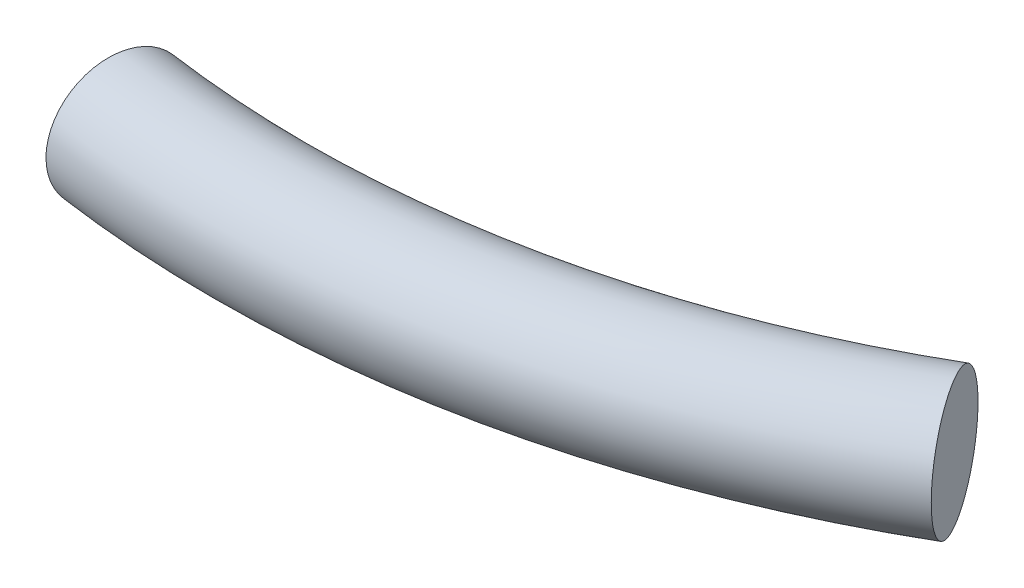
ISO-10303-21;
HEADER;
FILE_DESCRIPTION(('STEP AP214'),'2;1');
FILE_NAME('part.step','',(''),(''),'','','');
FILE_SCHEMA(('AUTOMOTIVE_DESIGN { 1 0 10303 214 1 1 1 1 }'));
ENDSEC;
DATA;
#1=APPLICATION_CONTEXT('core data for automotive mechanical design processes');
#2=APPLICATION_PROTOCOL_DEFINITION('international standard','automotive_design',2000,#1);
#3=PRODUCT_CONTEXT('',#1,'mechanical');
#4=PRODUCT('Part','Part','',(#3));
#5=PRODUCT_RELATED_PRODUCT_CATEGORY('part','',(#4));
#6=PRODUCT_DEFINITION_FORMATION('','',#4);
#7=PRODUCT_DEFINITION_CONTEXT('part definition',#1,'design');
#8=PRODUCT_DEFINITION('design','',#6,#7);
#9=PRODUCT_DEFINITION_SHAPE('','',#8);
#10=(LENGTH_UNIT() NAMED_UNIT(*) SI_UNIT(.MILLI.,.METRE.));
#11=(NAMED_UNIT(*) PLANE_ANGLE_UNIT() SI_UNIT($,.RADIAN.));
#12=(NAMED_UNIT(*) SI_UNIT($,.STERADIAN.) SOLID_ANGLE_UNIT());
#13=UNCERTAINTY_MEASURE_WITH_UNIT(LENGTH_MEASURE(1.E-05),#10,'distance_accuracy_value','');
#14=(GEOMETRIC_REPRESENTATION_CONTEXT(3) GLOBAL_UNCERTAINTY_ASSIGNED_CONTEXT((#13)) GLOBAL_UNIT_ASSIGNED_CONTEXT((#10,
#11,#12)) REPRESENTATION_CONTEXT('',''));
#15=CARTESIAN_POINT('',(0.,0.,0.));
#16=DIRECTION('',(0.,0.,1.));
#17=DIRECTION('',(1.,0.,0.));
#18=AXIS2_PLACEMENT_3D('',#15,#16,#17);
#19=CARTESIAN_POINT('',(0.,0.,0.));
#20=DIRECTION('',(0.990268068741566,0.,0.139173100960095));
#21=DIRECTION('',(0.139173100960095,0.,-0.990268068741566));
#22=AXIS2_PLACEMENT_3D('',#19,#20,#21);
#23=PLANE('',#22);
#24=CARTESIAN_POINT('',(-1.01069952865196,5.2698,7.19150082459654));
#25=CARTESIAN_POINT('',(-1.01069927178318,5.24734475844036,7.19149899688026));
#26=CARTESIAN_POINT('',(-1.01043539930995,5.22486914274062,7.18962144667368));
#27=CARTESIAN_POINT('',(-1.00938562896349,5.1805175487025,7.18215194253495));
#28=CARTESIAN_POINT('',(-1.00859861383822,5.158642958289,7.17655203894157));
#29=CARTESIAN_POINT('',(-1.00652600498841,5.11619038165277,7.16180466068529));
#30=CARTESIAN_POINT('',(-1.00524130113906,5.09561015699665,7.15266351781338));
#31=CARTESIAN_POINT('',(-1.00220740027461,5.05626266277757,7.13107619146179));
#32=CARTESIAN_POINT('',(-1.00045754432399,5.03749801701042,7.11862531941221));
#33=CARTESIAN_POINT('',(-0.996546737400909,5.00237251506183,7.09079848224164));
#34=CARTESIAN_POINT('',(-0.994386369577103,4.98600830669737,7.07542666643893));
#35=CARTESIAN_POINT('',(-0.989710874817703,4.9560951150933,7.04215879259073));
#36=CARTESIAN_POINT('',(-0.98719525548802,4.94255010496093,7.02425923097925));
#37=CARTESIAN_POINT('',(-0.981885019282246,4.91869805812555,6.98647493706198));
#38=CARTESIAN_POINT('',(-0.979090606951195,4.90838867019989,6.96659166016979));
#39=CARTESIAN_POINT('',(-0.973300394573009,4.89128651697562,6.92539215832789));
#40=CARTESIAN_POINT('',(-0.970304582689795,4.88449395856254,6.90407584916011));
#41=CARTESIAN_POINT('',(-0.964196859795768,4.87461938707083,6.86061714260724));
#42=CARTESIAN_POINT('',(-0.961084952201854,4.87153726487626,6.83847476953465));
#43=CARTESIAN_POINT('',(-0.954833291639521,4.8691706838228,6.79399189325481));
#44=CARTESIAN_POINT('',(-0.951693538671101,4.86988622496392,6.77165139004755));
#45=CARTESIAN_POINT('',(-0.945475222947479,4.87509474506563,6.72740577462348));
#46=CARTESIAN_POINT('',(-0.942396661994562,4.87958783511791,6.70550067523059));
#47=CARTESIAN_POINT('',(-0.936388403739214,4.89222364907398,6.66274969635622));
#48=CARTESIAN_POINT('',(-0.933458697691698,4.90036615830119,6.64190375465024));
#49=CARTESIAN_POINT('',(-0.927829048823482,4.92007688548478,6.60184672154569));
#50=CARTESIAN_POINT('',(-0.925129275031465,4.93164759608104,6.5826368328487));
#51=CARTESIAN_POINT('',(-0.920042216243384,4.95786514969766,6.54644052877201));
#52=CARTESIAN_POINT('',(-0.917654499681348,4.97250766984349,6.52945104264086));
#53=CARTESIAN_POINT('',(-0.913251671250836,5.00448602525169,6.49812329053354));
#54=CARTESIAN_POINT('',(-0.91123709028082,5.02182563442235,6.48378880209621));
#55=CARTESIAN_POINT('',(-0.907644571500182,5.05866468164223,6.45822670273738));
#56=CARTESIAN_POINT('',(-0.906066016771936,5.07816101291839,6.44699470221888));
#57=CARTESIAN_POINT('',(-0.903384060007921,5.11881373737466,6.42791158826347));
#58=CARTESIAN_POINT('',(-0.90228151018648,5.1399730284603,6.42006653864657));
#59=CARTESIAN_POINT('',(-0.900588958570666,5.18328650996402,6.40802340812585));
#60=CARTESIAN_POINT('',(-0.899997866006126,5.20543847660513,6.40381756598899));
#61=CARTESIAN_POINT('',(-0.899463765195616,5.241730237853,6.40001724125318));
#62=CARTESIAN_POINT('',(-0.899360887291289,5.25576113714254,6.39928522692762));
#63=CARTESIAN_POINT('',(-0.899361304752654,5.29225524155964,6.39928819731958));
#64=CARTESIAN_POINT('',(-0.899625177225881,5.31473085725938,6.40116574752616));
#65=CARTESIAN_POINT('',(-0.90067494757235,5.3590824512975,6.40863525166488));
#66=CARTESIAN_POINT('',(-0.90146196269762,5.380957041711,6.41423515525827));
#67=CARTESIAN_POINT('',(-0.90353457154743,5.42340961834723,6.42898253351455));
#68=CARTESIAN_POINT('',(-0.904819275396779,5.44398984300335,6.43812367638645));
#69=CARTESIAN_POINT('',(-0.907853176261226,5.48333733722242,6.45971100273805));
#70=CARTESIAN_POINT('',(-0.909603032211847,5.50210198298958,6.47216187478762));
#71=CARTESIAN_POINT('',(-0.913513839134928,5.53722748493817,6.49998871195819));
#72=CARTESIAN_POINT('',(-0.915674206958731,5.55359169330263,6.51536052776091));
#73=CARTESIAN_POINT('',(-0.920349701718132,5.5835048849067,6.5486284016091));
#74=CARTESIAN_POINT('',(-0.92286532104782,5.59704989503907,6.56652796322059));
#75=CARTESIAN_POINT('',(-0.928175557253594,5.62090194187445,6.60431225713785));
#76=CARTESIAN_POINT('',(-0.930969969584641,5.6312113298001,6.62419553403005));
#77=CARTESIAN_POINT('',(-0.936760181962824,5.64831348302438,6.66539503587195));
#78=CARTESIAN_POINT('',(-0.939755993846039,5.65510604143746,6.68671134503973));
#79=CARTESIAN_POINT('',(-0.945863716740068,5.66498061292917,6.7301700515926));
#80=CARTESIAN_POINT('',(-0.948975624333981,5.66806273512374,6.75231242466518));
#81=CARTESIAN_POINT('',(-0.955227284896314,5.6704293161772,6.79679530094502));
#82=CARTESIAN_POINT('',(-0.958367037864734,5.66971377503608,6.81913580415228));
#83=CARTESIAN_POINT('',(-0.964585353588356,5.66450525493437,6.86338141957636));
#84=CARTESIAN_POINT('',(-0.967663914541272,5.66001216488209,6.88528651896925));
#85=CARTESIAN_POINT('',(-0.973672172796621,5.64737635092602,6.92803749784361));
#86=CARTESIAN_POINT('',(-0.976601878844139,5.63923384169881,6.94888343954959));
#87=CARTESIAN_POINT('',(-0.982231527712355,5.61952311451522,6.98894047265414));
#88=CARTESIAN_POINT('',(-0.984931301504369,5.60795240391896,7.00815036135113));
#89=CARTESIAN_POINT('',(-0.990018360292451,5.58173485030234,7.04434666542783));
#90=CARTESIAN_POINT('',(-0.992406076854489,5.56709233015651,7.06133615155898));
#91=CARTESIAN_POINT('',(-0.996808905285002,5.53511397474831,7.09266390366629));
#92=CARTESIAN_POINT('',(-0.998823486255016,5.51777436557765,7.10699839210362));
#93=CARTESIAN_POINT('',(-1.00241600503565,5.48093531835777,7.13256049146246));
#94=CARTESIAN_POINT('',(-1.0039945597639,5.46143898708161,7.14379249198096));
#95=CARTESIAN_POINT('',(-1.00667651652791,5.42078626262534,7.16287560593637));
#96=CARTESIAN_POINT('',(-1.00777906634936,5.3996269715397,7.17072065555326));
#97=CARTESIAN_POINT('',(-1.00947161796517,5.35631349003598,7.18276378607399));
#98=CARTESIAN_POINT('',(-1.01006271052971,5.33416152339487,7.18696962821084));
#99=CARTESIAN_POINT('',(-1.01059681134022,5.29786976214701,7.19076995294666));
#100=CARTESIAN_POINT('',(-1.01069968924455,5.28383886285746,7.19150196727222));
#101=CARTESIAN_POINT('',(-1.01069952865196,5.2698,7.19150082459654));
#102=B_SPLINE_CURVE_WITH_KNOTS('',3,(#24,#25,#26,#27,#28,#29,#30,#31,#32,#33,#34,#35,#36,#37,
#38,#39,#40,#41,#42,#43,#44,#45,#46,#47,#48,#49,#50,#51,#52,#53,#54,#55,#56,#57,#58,#59,#60,#61,
#62,#63,#64,#65,#66,#67,#68,#69,#70,#71,#72,#73,#74,#75,#76,#77,#78,#79,#80,#81,#82,#83,#84,#85,
#86,#87,#88,#89,#90,#91,#92,#93,#94,#95,#96,#97,#98,#99,#100,#101),.UNSPECIFIED.,.T.,.F.,(4,2,2,
2,2,2,2,2,2,2,2,2,2,2,2,2,2,2,2,2,2,2,2,2,2,2,2,2,2,2,2,2,2,2,2,2,2,2,4),(0.,0.067321719094076,
0.134787678055462,0.202133559490901,0.269575356418627,0.336922056232695,0.404363034793471,
0.471754892083668,0.539150713403567,0.606544552708822,0.673938392014078,0.741334213333977,
0.808726070624174,0.876167049184949,0.943513748999019,1.01095554592846,1.07830142736561,
1.14576738632871,1.2130891054245,1.25517818200736,1.32249990110144,1.38996586006282,
1.45731174149826,1.52475353842599,1.59210023824006,1.65954121680083,1.72693307409103,
1.79432889541093,1.86172273471618,1.92911657402144,1.99651239534134,2.06390425263154,
2.13134523119231,2.19869193100638,2.26613372793582,2.33347960937297,2.40094556833607,
2.46826728743186,2.51035636401472),.UNSPECIFIED.);
#103=CARTESIAN_POINT('',(-1.01069952865196,5.2698,7.19150082459654));
#104=VERTEX_POINT('',#103);
#105=EDGE_CURVE('E18',#104,#104,#102,.T.);
#106=ORIENTED_EDGE('',*,*,#105,.F.);
#107=EDGE_LOOP('',(#106));
#108=FACE_BOUND('',#107,.T.);
#109=ADVANCED_FACE('F14',(#108),#23,.F.);
#110=CARTESIAN_POINT('',(0.,0.,0.));
#111=DIRECTION('',(0.866025403784429,0.,-0.500000000000017));
#112=DIRECTION('',(-0.500000000000017,0.,-0.866025403784429));
#113=AXIS2_PLACEMENT_3D('',#110,#111,#112);
#114=PLANE('',#113);
#115=CARTESIAN_POINT('',(3.23108791023411,5.2698,5.59640842424678));
#116=CARTESIAN_POINT('',(3.23108883307326,5.24734475844036,5.59641002265107));
#117=CARTESIAN_POINT('',(3.23203683405696,5.22486914274062,5.59805200852046));
#118=CARTESIAN_POINT('',(3.23580828967312,5.18051754870249,5.60458436126614));
#119=CARTESIAN_POINT('',(3.23863575819914,5.158642958289,5.60948168041002));
#120=CARTESIAN_POINT('',(3.24608191279192,5.11619038165277,5.62237879848572));
#121=CARTESIAN_POINT('',(3.25069740185011,5.09561015699665,5.63037306003628));
#122=CARTESIAN_POINT('',(3.26159714053351,5.05626266277757,5.64925196122515));
#123=CARTESIAN_POINT('',(3.26788375748229,5.03749801701042,5.66014070118817));
#124=CARTESIAN_POINT('',(3.2819339111977,5.00237251506183,5.68447628127742));
#125=CARTESIAN_POINT('',(3.28969535291633,4.98600830669737,5.69791949267407));
#126=CARTESIAN_POINT('',(3.30649276106182,4.9560951150933,5.72701345701752));
#127=CARTESIAN_POINT('',(3.31553049648746,4.94255010496093,5.74266727396009));
#128=CARTESIAN_POINT('',(3.33460830739036,4.91869805812555,5.77571101174111));
#129=CARTESIAN_POINT('',(3.34464764800924,4.90838867019989,5.7930996597675));
#130=CARTESIAN_POINT('',(3.36544984447624,4.89128651697562,5.82913012095736));
#131=CARTESIAN_POINT('',(3.37621274284721,4.88449395856254,5.84777200777259));
#132=CARTESIAN_POINT('',(3.39815564291875,4.87461938707083,5.88577822556191));
#133=CARTESIAN_POINT('',(3.4093356323436,4.87153726487626,5.90514253527382));
#134=CARTESIAN_POINT('',(3.43179564982976,4.8691706838228,5.94404442669873));
#135=CARTESIAN_POINT('',(3.44307567789108,4.86988622496392,5.96358200841173));
#136=CARTESIAN_POINT('',(3.46541589910022,4.87509474506563,6.0022764065983));
#137=CARTESIAN_POINT('',(3.47647608577307,4.87958783511791,6.02143321185687));
#138=CARTESIAN_POINT('',(3.49806164438282,4.89222364907398,6.05882049607871));
#139=CARTESIAN_POINT('',(3.50858704773773,4.90036615830119,6.07705102945957));
#140=CARTESIAN_POINT('',(3.52881239598886,4.92007688548478,6.1120823602313));
#141=CARTESIAN_POINT('',(3.53851173362448,4.93164759608104,6.12888210581595));
#142=CARTESIAN_POINT('',(3.55678774656444,4.95786514969766,6.16053708878774));
#143=CARTESIAN_POINT('',(3.56536597233351,4.97250766984349,6.17539501165859));
#144=CARTESIAN_POINT('',(3.58118378626501,5.00448602525169,6.20279226905261));
#145=CARTESIAN_POINT('',(3.588421467096,5.02182563442235,6.21532829998084));
#146=CARTESIAN_POINT('',(3.601328123468,5.05866468164223,6.23768328457299));
#147=CARTESIAN_POINT('',(3.60699931537706,5.07816101291839,6.24750607709896));
#148=CARTESIAN_POINT('',(3.61663464269791,5.11881373737466,6.26419495356622));
#149=CARTESIAN_POINT('',(3.62059571640337,5.1399730284603,6.27105573447659));
#150=CARTESIAN_POINT('',(3.626676459033,5.18328650996402,6.28158788965887));
#151=CARTESIAN_POINT('',(3.62880004671073,5.20543847660513,6.28526605141102));
#152=CARTESIAN_POINT('',(3.63071888306211,5.241730237853,6.28858957346302));
#153=CARTESIAN_POINT('',(3.63108848718682,5.25576113714254,6.28922974658571));
#154=CARTESIAN_POINT('',(3.63108698739497,5.29225524155964,6.28922714887002));
#155=CARTESIAN_POINT('',(3.63013898641127,5.31473085725938,6.28758516300063));
#156=CARTESIAN_POINT('',(3.62636753079511,5.35908245129751,6.28105281025495));
#157=CARTESIAN_POINT('',(3.62354006226909,5.380957041711,6.27615549111107));
#158=CARTESIAN_POINT('',(3.61609390767631,5.42340961834723,6.26325837303537));
#159=CARTESIAN_POINT('',(3.61147841861812,5.44398984300335,6.25526411148481));
#160=CARTESIAN_POINT('',(3.60057867993472,5.48333733722242,6.23638521029594));
#161=CARTESIAN_POINT('',(3.59429206298594,5.50210198298958,6.22549647033293));
#162=CARTESIAN_POINT('',(3.58024190927052,5.53722748493817,6.20116089024368));
#163=CARTESIAN_POINT('',(3.5724804675519,5.55359169330263,6.18771767884702));
#164=CARTESIAN_POINT('',(3.55568305940641,5.5835048849067,6.15862371450357));
#165=CARTESIAN_POINT('',(3.54664532398077,5.59704989503907,6.142969897561));
#166=CARTESIAN_POINT('',(3.52756751307787,5.62090194187445,6.10992615977999));
#167=CARTESIAN_POINT('',(3.51752817245899,5.6312113298001,6.09253751175359));
#168=CARTESIAN_POINT('',(3.49672597599199,5.64831348302438,6.05650705056373));
#169=CARTESIAN_POINT('',(3.48596307762102,5.65510604143746,6.0378651637485));
#170=CARTESIAN_POINT('',(3.46402017754947,5.66498061292917,5.99985894595919));
#171=CARTESIAN_POINT('',(3.45284018812463,5.66806273512374,5.98049463624727));
#172=CARTESIAN_POINT('',(3.43038017063847,5.6704293161772,5.94159274482236));
#173=CARTESIAN_POINT('',(3.41910014257715,5.66971377503608,5.92205516310936));
#174=CARTESIAN_POINT('',(3.39675992136801,5.66450525493437,5.8833607649228));
#175=CARTESIAN_POINT('',(3.38569973469516,5.66001216488209,5.86420395966422));
#176=CARTESIAN_POINT('',(3.36411417608541,5.64737635092602,5.82681667544238));
#177=CARTESIAN_POINT('',(3.3535887727305,5.63923384169881,5.80858614206153));
#178=CARTESIAN_POINT('',(3.33336342447937,5.61952311451522,5.77355481128979));
#179=CARTESIAN_POINT('',(3.32366408684375,5.60795240391896,5.75675506570514));
#180=CARTESIAN_POINT('',(3.30538807390379,5.58173485030234,5.72510008273334));
#181=CARTESIAN_POINT('',(3.29680984813471,5.56709233015651,5.7102421598625));
#182=CARTESIAN_POINT('',(3.28099203420321,5.53511397474831,5.68284490246848));
#183=CARTESIAN_POINT('',(3.27375435337223,5.51777436557765,5.67030887154025));
#184=CARTESIAN_POINT('',(3.26084769700023,5.48093531835777,5.6479538869481));
#185=CARTESIAN_POINT('',(3.25517650509116,5.46143898708161,5.63813109442213));
#186=CARTESIAN_POINT('',(3.24554117777032,5.42078626262534,5.62144221795487));
#187=CARTESIAN_POINT('',(3.24158010406486,5.3996269715397,5.6145814370445));
#188=CARTESIAN_POINT('',(3.23549936143523,5.35631349003598,5.60404928186222));
#189=CARTESIAN_POINT('',(3.2333757737575,5.33416152339487,5.60037112011007));
#190=CARTESIAN_POINT('',(3.23145693740612,5.297869762147,5.59704759805807));
#191=CARTESIAN_POINT('',(3.23108733328141,5.28383886285746,5.59640742493538));
#192=CARTESIAN_POINT('',(3.23108791023411,5.2698,5.59640842424678));
#193=B_SPLINE_CURVE_WITH_KNOTS('',3,(#115,#116,#117,#118,#119,#120,#121,#122,#123,#124,#125,
#126,#127,#128,#129,#130,#131,#132,#133,#134,#135,#136,#137,#138,#139,#140,#141,#142,#143,#144,
#145,#146,#147,#148,#149,#150,#151,#152,#153,#154,#155,#156,#157,#158,#159,#160,#161,#162,#163,
#164,#165,#166,#167,#168,#169,#170,#171,#172,#173,#174,#175,#176,#177,#178,#179,#180,#181,#182,
#183,#184,#185,#186,#187,#188,#189,#190,#191,#192),.UNSPECIFIED.,.T.,.F.,(4,2,2,2,2,2,2,2,2,2,2,
2,2,2,2,2,2,2,2,2,2,2,2,2,2,2,2,2,2,2,2,2,2,2,2,2,2,2,4),(0.,0.0673217190940759,
0.134787678055462,0.2021335594909,0.269575356418626,0.336922056232695,0.40436303479347,
0.471754892083668,0.539150713403567,0.606544552708822,0.673938392014078,0.741334213333977,
0.808726070624174,0.876167049184948,0.943513748999018,1.01095554592846,1.07830142736561,
1.14576738632871,1.2130891054245,1.25517818200736,1.32249990110144,1.38996586006282,
1.45731174149826,1.52475353842599,1.59210023824006,1.65954121680083,1.72693307409103,
1.79432889541093,1.86172273471618,1.92911657402144,1.99651239534134,2.06390425263154,
2.13134523119231,2.19869193100638,2.26613372793582,2.33347960937297,2.40094556833608,
2.46826728743186,2.51035636401472),.UNSPECIFIED.);
#194=CARTESIAN_POINT('',(3.23108791023411,5.2698,5.59640842424678));
#195=VERTEX_POINT('',#194);
#196=EDGE_CURVE('E10',#195,#195,#193,.T.);
#197=ORIENTED_EDGE('',*,*,#196,.F.);
#198=EDGE_LOOP('',(#197));
#199=FACE_BOUND('',#198,.T.);
#200=ADVANCED_FACE('F36',(#199),#114,.T.);
#201=CARTESIAN_POINT('',(0.,5.2698,0.));
#202=DIRECTION('',(0.,1.,0.));
#203=DIRECTION('',(0.866025403784429,0.,-0.500000000000017));
#204=AXIS2_PLACEMENT_3D('',#201,#202,#203);
#205=TOROIDAL_SURFACE('',#204,6.862175820468,0.4);
#206=ORIENTED_EDGE('',*,*,#196,.T.);
#207=EDGE_LOOP('',(#206));
#208=FACE_BOUND('',#207,.T.);
#209=ORIENTED_EDGE('',*,*,#105,.T.);
#210=EDGE_LOOP('',(#209));
#211=FACE_BOUND('',#210,.T.);
#212=ADVANCED_FACE('F34',(#208,#211),#205,.T.);
#213=CLOSED_SHELL('',(#109,#200,#212));
#214=MANIFOLD_SOLID_BREP('B1',#213);
#215=ADVANCED_BREP_SHAPE_REPRESENTATION('',(#18,#214),#14);
#216=SHAPE_DEFINITION_REPRESENTATION(#9,#215);
ENDSEC;
END-ISO-10303-21;
